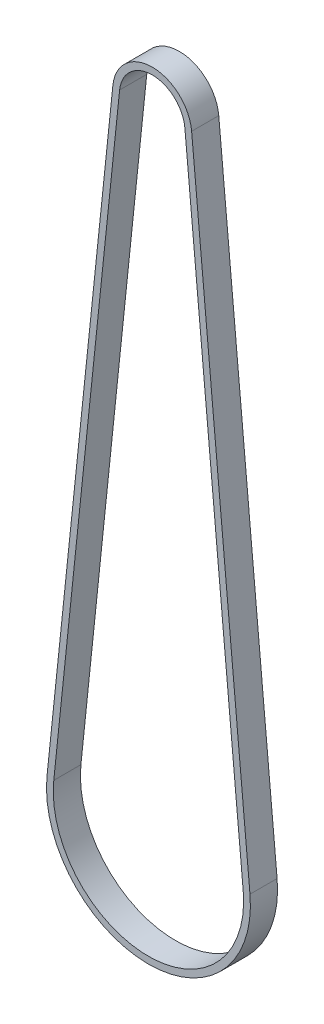
ISO-10303-21;
HEADER;
FILE_DESCRIPTION(('STEP AP214'),'2;1');
FILE_NAME('part.step','',(''),(''),'','','');
FILE_SCHEMA(('AUTOMOTIVE_DESIGN { 1 0 10303 214 1 1 1 1 }'));
ENDSEC;
DATA;
#1=APPLICATION_CONTEXT('core data for automotive mechanical design processes');
#2=APPLICATION_PROTOCOL_DEFINITION('international standard','automotive_design',2000,#1);
#3=PRODUCT_CONTEXT('',#1,'mechanical');
#4=PRODUCT('Part','Part','',(#3));
#5=PRODUCT_RELATED_PRODUCT_CATEGORY('part','',(#4));
#6=PRODUCT_DEFINITION_FORMATION('','',#4);
#7=PRODUCT_DEFINITION_CONTEXT('part definition',#1,'design');
#8=PRODUCT_DEFINITION('design','',#6,#7);
#9=PRODUCT_DEFINITION_SHAPE('','',#8);
#10=(LENGTH_UNIT() NAMED_UNIT(*) SI_UNIT(.MILLI.,.METRE.));
#11=(NAMED_UNIT(*) PLANE_ANGLE_UNIT() SI_UNIT($,.RADIAN.));
#12=(NAMED_UNIT(*) SI_UNIT($,.STERADIAN.) SOLID_ANGLE_UNIT());
#13=UNCERTAINTY_MEASURE_WITH_UNIT(LENGTH_MEASURE(1.E-05),#10,'distance_accuracy_value','');
#14=(GEOMETRIC_REPRESENTATION_CONTEXT(3) GLOBAL_UNCERTAINTY_ASSIGNED_CONTEXT((#13)) GLOBAL_UNIT_ASSIGNED_CONTEXT((#10,
#11,#12)) REPRESENTATION_CONTEXT('',''));
#15=CARTESIAN_POINT('',(0.,0.,0.));
#16=DIRECTION('',(0.,0.,1.));
#17=DIRECTION('',(1.,0.,0.));
#18=AXIS2_PLACEMENT_3D('',#15,#16,#17);
#19=CARTESIAN_POINT('',(-0.83926050661585,-140.937680150053,6.));
#20=DIRECTION('',(0.,0.,-1.));
#21=DIRECTION('',(-1.,0.,0.));
#22=AXIS2_PLACEMENT_3D('',#19,#20,#21);
#23=CYLINDRICAL_SURFACE('',#22,22.55);
#24=CARTESIAN_POINT('',(-0.83926050661585,-140.937680150053,0.));
#25=DIRECTION('',(0.,0.,-1.));
#26=DIRECTION('',(-1.,0.,0.));
#27=AXIS2_PLACEMENT_3D('',#24,#25,#26);
#28=CIRCLE('',#27,22.55);
#29=CARTESIAN_POINT('',(21.6151342038601,-138.86339516815,0.));
#30=VERTEX_POINT('',#29);
#31=CARTESIAN_POINT('',(-23.2673596356714,-138.596127362423,0.));
#32=VERTEX_POINT('',#31);
#33=EDGE_CURVE('E164',#30,#32,#28,.T.);
#34=ORIENTED_EDGE('',*,*,#33,.F.);
#35=DIRECTION('',(0.,0.,-1.));
#36=VECTOR('',#35,1.);
#37=CARTESIAN_POINT('',(21.6151342038601,-138.86339516815,6.));
#38=LINE('',#37,#36);
#39=CARTESIAN_POINT('',(21.6151342038601,-138.86339516815,6.));
#40=VERTEX_POINT('',#39);
#41=EDGE_CURVE('E12',#40,#30,#38,.T.);
#42=ORIENTED_EDGE('',*,*,#41,.F.);
#43=CARTESIAN_POINT('',(-0.83926050661585,-140.937680150053,6.));
#44=DIRECTION('',(0.,0.,-1.));
#45=DIRECTION('',(-1.,0.,0.));
#46=AXIS2_PLACEMENT_3D('',#43,#44,#45);
#47=CIRCLE('',#46,22.55);
#48=CARTESIAN_POINT('',(-23.2673596356714,-138.596127362423,6.));
#49=VERTEX_POINT('',#48);
#50=EDGE_CURVE('E166',#40,#49,#47,.T.);
#51=ORIENTED_EDGE('',*,*,#50,.T.);
#52=DIRECTION('',(0.,0.,-1.));
#53=VECTOR('',#52,1.);
#54=CARTESIAN_POINT('',(-23.2673596356714,-138.596127362423,6.));
#55=LINE('',#54,#53);
#56=EDGE_CURVE('E70',#49,#32,#55,.T.);
#57=ORIENTED_EDGE('',*,*,#56,.T.);
#58=EDGE_LOOP('',(#34,#42,#51,#57));
#59=FACE_BOUND('',#58,.T.);
#60=ADVANCED_FACE('F67',(#59),#23,.T.);
#61=CARTESIAN_POINT('',(21.6151342038601,-138.86339516815,6.));
#62=DIRECTION('',(0.995760297582082,0.0919860302396105,0.));
#63=DIRECTION('',(-0.0919860302396106,0.995760297582083,0.));
#64=AXIS2_PLACEMENT_3D('',#61,#62,#63);
#65=PLANE('',#64);
#66=DIRECTION('',(0.0919860302396106,-0.995760297582083,0.));
#67=VECTOR('',#66,1.);
#68=CARTESIAN_POINT('',(21.6151342038601,-138.86339516815,0.));
#69=LINE('',#68,#67);
#70=CARTESIAN_POINT('',(8.71290260384322,0.804877764596591,0.));
#71=VERTEX_POINT('',#70);
#72=EDGE_CURVE('E174',#71,#30,#69,.T.);
#73=ORIENTED_EDGE('',*,*,#72,.F.);
#74=DIRECTION('',(0.,0.,-1.));
#75=VECTOR('',#74,1.);
#76=CARTESIAN_POINT('',(8.71290260384322,0.804877764596591,6.));
#77=LINE('',#76,#75);
#78=CARTESIAN_POINT('',(8.71290260384322,0.804877764596591,6.));
#79=VERTEX_POINT('',#78);
#80=EDGE_CURVE('E73',#79,#71,#77,.T.);
#81=ORIENTED_EDGE('',*,*,#80,.F.);
#82=DIRECTION('',(0.0919860302396106,-0.995760297582083,0.));
#83=VECTOR('',#82,1.);
#84=CARTESIAN_POINT('',(21.6151342038601,-138.86339516815,6.));
#85=LINE('',#84,#83);
#86=EDGE_CURVE('E178',#79,#40,#85,.T.);
#87=ORIENTED_EDGE('',*,*,#86,.T.);
#88=ORIENTED_EDGE('',*,*,#41,.T.);
#89=EDGE_LOOP('',(#73,#81,#87,#88));
#90=FACE_BOUND('',#89,.T.);
#91=ADVANCED_FACE('F202',(#90),#65,.T.);
#92=CARTESIAN_POINT('',(0.,0.,6.));
#93=DIRECTION('',(0.,0.,-1.));
#94=DIRECTION('',(-1.,0.,0.));
#95=AXIS2_PLACEMENT_3D('',#92,#93,#94);
#96=CYLINDRICAL_SURFACE('',#95,8.75);
#97=CARTESIAN_POINT('',(0.,0.,0.));
#98=DIRECTION('',(0.,0.,-1.));
#99=DIRECTION('',(-1.,0.,0.));
#100=AXIS2_PLACEMENT_3D('',#97,#98,#99);
#101=CIRCLE('',#100,8.75);
#102=CARTESIAN_POINT('',(-8.70269921859139,0.908584784557187,0.));
#103=VERTEX_POINT('',#102);
#104=EDGE_CURVE('E187',#103,#71,#101,.T.);
#105=ORIENTED_EDGE('',*,*,#104,.F.);
#106=DIRECTION('',(0.,0.,-1.));
#107=VECTOR('',#106,1.);
#108=CARTESIAN_POINT('',(-8.70269921859139,0.908584784557187,6.));
#109=LINE('',#108,#107);
#110=CARTESIAN_POINT('',(-8.70269921859139,0.908584784557187,6.));
#111=VERTEX_POINT('',#110);
#112=EDGE_CURVE('E192',#111,#103,#109,.T.);
#113=ORIENTED_EDGE('',*,*,#112,.F.);
#114=CARTESIAN_POINT('',(0.,0.,6.));
#115=DIRECTION('',(0.,0.,-1.));
#116=DIRECTION('',(-1.,0.,0.));
#117=AXIS2_PLACEMENT_3D('',#114,#115,#116);
#118=CIRCLE('',#117,8.75);
#119=EDGE_CURVE('E176',#111,#79,#118,.T.);
#120=ORIENTED_EDGE('',*,*,#119,.T.);
#121=ORIENTED_EDGE('',*,*,#80,.T.);
#122=EDGE_LOOP('',(#105,#113,#120,#121));
#123=FACE_BOUND('',#122,.T.);
#124=ADVANCED_FACE('F207',(#123),#96,.T.);
#125=CARTESIAN_POINT('',(-23.2673596356714,-138.596127362423,6.));
#126=DIRECTION('',(-0.994594196410445,0.103838261092246,0.));
#127=DIRECTION('',(-0.103838261092246,-0.994594196410445,0.));
#128=AXIS2_PLACEMENT_3D('',#125,#126,#127);
#129=PLANE('',#128);
#130=DIRECTION('',(0.103838261092246,0.994594196410445,0.));
#131=VECTOR('',#130,1.);
#132=CARTESIAN_POINT('',(-23.2673596356714,-138.596127362423,0.));
#133=LINE('',#132,#131);
#134=EDGE_CURVE('E184',#32,#103,#133,.T.);
#135=ORIENTED_EDGE('',*,*,#134,.F.);
#136=ORIENTED_EDGE('',*,*,#56,.F.);
#137=DIRECTION('',(0.103838261092246,0.994594196410445,0.));
#138=VECTOR('',#137,1.);
#139=CARTESIAN_POINT('',(-23.2673596356714,-138.596127362423,6.));
#140=LINE('',#139,#138);
#141=EDGE_CURVE('E172',#49,#111,#140,.T.);
#142=ORIENTED_EDGE('',*,*,#141,.T.);
#143=ORIENTED_EDGE('',*,*,#112,.T.);
#144=EDGE_LOOP('',(#135,#136,#142,#143));
#145=FACE_BOUND('',#144,.T.);
#146=ADVANCED_FACE('F199',(#145),#129,.T.);
#147=CARTESIAN_POINT('',(-0.83926050661585,-140.937680150053,6.));
#148=DIRECTION('',(0.,0.,-1.));
#149=DIRECTION('',(-1.,0.,0.));
#150=AXIS2_PLACEMENT_3D('',#147,#148,#149);
#151=PLANE('',#150);
#152=DIRECTION('',(0.0919860302396106,-0.995760297582083,0.));
#153=VECTOR('',#152,1.);
#154=CARTESIAN_POINT('',(7.2192621574701,0.666898719237176,6.));
#155=LINE('',#154,#153);
#156=CARTESIAN_POINT('',(7.2192621574701,0.666898719237176,6.));
#157=VERTEX_POINT('',#156);
#158=CARTESIAN_POINT('',(20.121493757487,-139.001374213509,6.));
#159=VERTEX_POINT('',#158);
#160=EDGE_CURVE('E140',#157,#159,#155,.T.);
#161=ORIENTED_EDGE('',*,*,#160,.T.);
#162=CARTESIAN_POINT('',(-0.83926050661585,-140.937680150053,6.));
#163=DIRECTION('',(0.,0.,-1.));
#164=DIRECTION('',(-1.,0.,0.));
#165=AXIS2_PLACEMENT_3D('',#162,#163,#164);
#166=CIRCLE('',#165,21.05);
#167=CARTESIAN_POINT('',(-21.7754683410557,-138.751884754061,6.));
#168=VERTEX_POINT('',#167);
#169=EDGE_CURVE('E133',#159,#168,#166,.T.);
#170=ORIENTED_EDGE('',*,*,#169,.T.);
#171=DIRECTION('',(0.103838261092246,0.994594196410445,0.));
#172=VECTOR('',#171,1.);
#173=CARTESIAN_POINT('',(-21.7754683410557,-138.751884754061,6.));
#174=LINE('',#173,#172);
#175=CARTESIAN_POINT('',(-7.21080792397573,0.752827392918792,6.));
#176=VERTEX_POINT('',#175);
#177=EDGE_CURVE('E141',#168,#176,#174,.T.);
#178=ORIENTED_EDGE('',*,*,#177,.T.);
#179=CARTESIAN_POINT('',(0.,0.,6.));
#180=DIRECTION('',(0.,0.,-1.));
#181=DIRECTION('',(-1.,0.,0.));
#182=AXIS2_PLACEMENT_3D('',#179,#180,#181);
#183=CIRCLE('',#182,7.25);
#184=EDGE_CURVE('E84',#176,#157,#183,.T.);
#185=ORIENTED_EDGE('',*,*,#184,.T.);
#186=EDGE_LOOP('',(#161,#170,#178,#185));
#187=FACE_BOUND('',#186,.T.);
#188=ORIENTED_EDGE('',*,*,#50,.F.);
#189=ORIENTED_EDGE('',*,*,#86,.F.);
#190=ORIENTED_EDGE('',*,*,#119,.F.);
#191=ORIENTED_EDGE('',*,*,#141,.F.);
#192=EDGE_LOOP('',(#188,#189,#190,#191));
#193=FACE_BOUND('',#192,.T.);
#194=ADVANCED_FACE('F150',(#187,#193),#151,.F.);
#195=CARTESIAN_POINT('',(-0.83926050661585,-140.937680150053,0.));
#196=DIRECTION('',(0.,0.,-1.));
#197=DIRECTION('',(-1.,0.,0.));
#198=AXIS2_PLACEMENT_3D('',#195,#196,#197);
#199=PLANE('',#198);
#200=CARTESIAN_POINT('',(-0.83926050661585,-140.937680150053,0.));
#201=DIRECTION('',(0.,0.,-1.));
#202=DIRECTION('',(-1.,0.,0.));
#203=AXIS2_PLACEMENT_3D('',#200,#201,#202);
#204=CIRCLE('',#203,21.05);
#205=CARTESIAN_POINT('',(20.121493757487,-139.001374213509,0.));
#206=VERTEX_POINT('',#205);
#207=CARTESIAN_POINT('',(-21.7754683410557,-138.751884754061,0.));
#208=VERTEX_POINT('',#207);
#209=EDGE_CURVE('E93',#206,#208,#204,.T.);
#210=ORIENTED_EDGE('',*,*,#209,.F.);
#211=DIRECTION('',(0.0919860302396106,-0.995760297582083,0.));
#212=VECTOR('',#211,1.);
#213=CARTESIAN_POINT('',(7.2192621574701,0.666898719237176,0.));
#214=LINE('',#213,#212);
#215=CARTESIAN_POINT('',(7.2192621574701,0.666898719237176,0.));
#216=VERTEX_POINT('',#215);
#217=EDGE_CURVE('E147',#216,#206,#214,.T.);
#218=ORIENTED_EDGE('',*,*,#217,.F.);
#219=CARTESIAN_POINT('',(0.,0.,0.));
#220=DIRECTION('',(0.,0.,-1.));
#221=DIRECTION('',(-1.,0.,0.));
#222=AXIS2_PLACEMENT_3D('',#219,#220,#221);
#223=CIRCLE('',#222,7.25);
#224=CARTESIAN_POINT('',(-7.21080792397573,0.752827392918783,0.));
#225=VERTEX_POINT('',#224);
#226=EDGE_CURVE('E153',#225,#216,#223,.T.);
#227=ORIENTED_EDGE('',*,*,#226,.F.);
#228=DIRECTION('',(0.103838261092246,0.994594196410445,0.));
#229=VECTOR('',#228,1.);
#230=CARTESIAN_POINT('',(-21.7754683410557,-138.751884754061,0.));
#231=LINE('',#230,#229);
#232=EDGE_CURVE('E157',#208,#225,#231,.T.);
#233=ORIENTED_EDGE('',*,*,#232,.F.);
#234=EDGE_LOOP('',(#210,#218,#227,#233));
#235=FACE_BOUND('',#234,.T.);
#236=ORIENTED_EDGE('',*,*,#33,.T.);
#237=ORIENTED_EDGE('',*,*,#134,.T.);
#238=ORIENTED_EDGE('',*,*,#104,.T.);
#239=ORIENTED_EDGE('',*,*,#72,.T.);
#240=EDGE_LOOP('',(#236,#237,#238,#239));
#241=FACE_BOUND('',#240,.T.);
#242=ADVANCED_FACE('F205',(#235,#241),#199,.T.);
#243=CARTESIAN_POINT('',(-0.83926050661585,-140.937680150053,6.));
#244=DIRECTION('',(0.,0.,-1.));
#245=DIRECTION('',(-1.,0.,0.));
#246=AXIS2_PLACEMENT_3D('',#243,#244,#245);
#247=CYLINDRICAL_SURFACE('',#246,21.05);
#248=ORIENTED_EDGE('',*,*,#209,.T.);
#249=DIRECTION('',(0.,0.,-1.));
#250=VECTOR('',#249,1.);
#251=CARTESIAN_POINT('',(-21.7754683410557,-138.751884754061,6.));
#252=LINE('',#251,#250);
#253=EDGE_CURVE('E128',#168,#208,#252,.T.);
#254=ORIENTED_EDGE('',*,*,#253,.F.);
#255=ORIENTED_EDGE('',*,*,#169,.F.);
#256=DIRECTION('',(0.,0.,-1.));
#257=VECTOR('',#256,1.);
#258=CARTESIAN_POINT('',(20.121493757487,-139.001374213509,6.));
#259=LINE('',#258,#257);
#260=EDGE_CURVE('E162',#159,#206,#259,.T.);
#261=ORIENTED_EDGE('',*,*,#260,.T.);
#262=EDGE_LOOP('',(#248,#254,#255,#261));
#263=FACE_BOUND('',#262,.T.);
#264=ADVANCED_FACE('F132',(#263),#247,.F.);
#265=CARTESIAN_POINT('',(7.2192621574701,0.666898719237176,6.));
#266=DIRECTION('',(0.995760297582082,0.0919860302396105,0.));
#267=DIRECTION('',(-0.0919860302396106,0.995760297582083,0.));
#268=AXIS2_PLACEMENT_3D('',#265,#266,#267);
#269=PLANE('',#268);
#270=ORIENTED_EDGE('',*,*,#217,.T.);
#271=ORIENTED_EDGE('',*,*,#260,.F.);
#272=ORIENTED_EDGE('',*,*,#160,.F.);
#273=DIRECTION('',(0.,0.,-1.));
#274=VECTOR('',#273,1.);
#275=CARTESIAN_POINT('',(7.2192621574701,0.666898719237176,6.));
#276=LINE('',#275,#274);
#277=EDGE_CURVE('E167',#157,#216,#276,.T.);
#278=ORIENTED_EDGE('',*,*,#277,.T.);
#279=EDGE_LOOP('',(#270,#271,#272,#278));
#280=FACE_BOUND('',#279,.T.);
#281=ADVANCED_FACE('F265',(#280),#269,.F.);
#282=CARTESIAN_POINT('',(0.,0.,6.));
#283=DIRECTION('',(0.,0.,-1.));
#284=DIRECTION('',(-1.,0.,0.));
#285=AXIS2_PLACEMENT_3D('',#282,#283,#284);
#286=CYLINDRICAL_SURFACE('',#285,7.25);
#287=ORIENTED_EDGE('',*,*,#226,.T.);
#288=ORIENTED_EDGE('',*,*,#277,.F.);
#289=ORIENTED_EDGE('',*,*,#184,.F.);
#290=DIRECTION('',(0.,0.,-1.));
#291=VECTOR('',#290,1.);
#292=CARTESIAN_POINT('',(-7.21080792397573,0.752827392918783,6.));
#293=LINE('',#292,#291);
#294=EDGE_CURVE('E138',#176,#225,#293,.T.);
#295=ORIENTED_EDGE('',*,*,#294,.T.);
#296=EDGE_LOOP('',(#287,#288,#289,#295));
#297=FACE_BOUND('',#296,.T.);
#298=ADVANCED_FACE('F271',(#297),#286,.F.);
#299=CARTESIAN_POINT('',(-21.7754683410557,-138.751884754061,6.));
#300=DIRECTION('',(-0.994594196410445,0.103838261092246,0.));
#301=DIRECTION('',(-0.103838261092246,-0.994594196410445,0.));
#302=AXIS2_PLACEMENT_3D('',#299,#300,#301);
#303=PLANE('',#302);
#304=ORIENTED_EDGE('',*,*,#232,.T.);
#305=ORIENTED_EDGE('',*,*,#294,.F.);
#306=ORIENTED_EDGE('',*,*,#177,.F.);
#307=ORIENTED_EDGE('',*,*,#253,.T.);
#308=EDGE_LOOP('',(#304,#305,#306,#307));
#309=FACE_BOUND('',#308,.T.);
#310=ADVANCED_FACE('F145',(#309),#303,.F.);
#311=CLOSED_SHELL('',(#60,#91,#124,#146,#194,#242,#264,#281,#298,#310));
#312=MANIFOLD_SOLID_BREP('B2',#311);
#313=ADVANCED_BREP_SHAPE_REPRESENTATION('',(#18,#312),#14);
#314=SHAPE_DEFINITION_REPRESENTATION(#9,#313);
ENDSEC;
END-ISO-10303-21;
